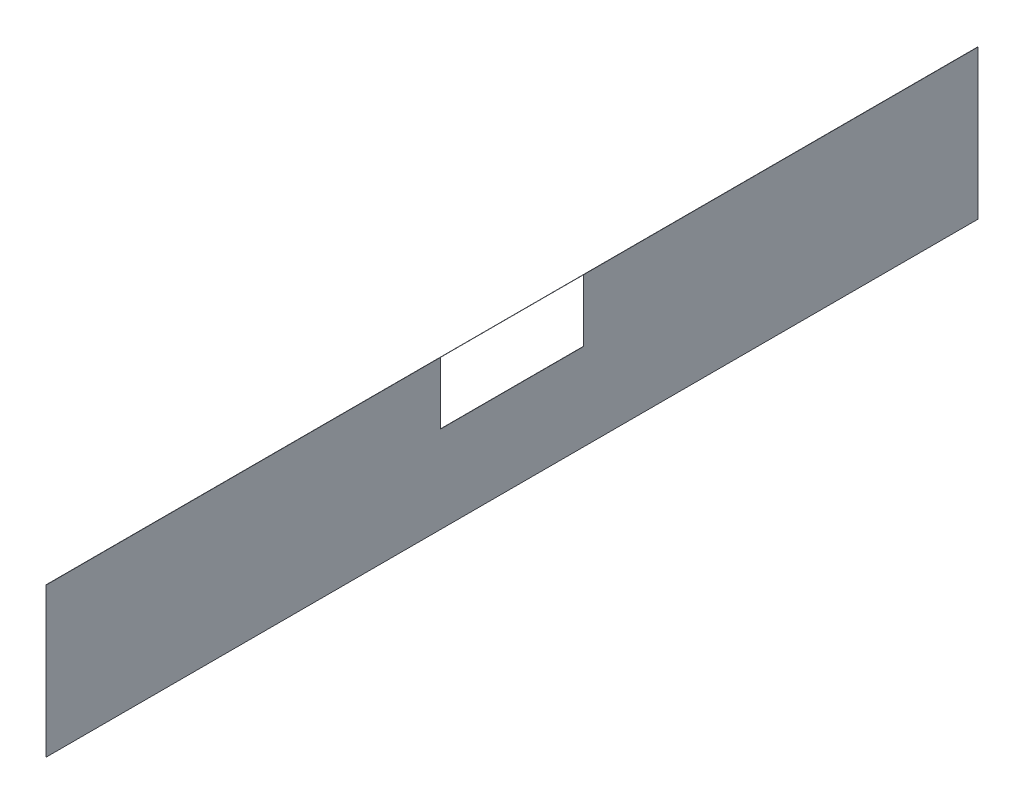
ISO-10303-21;
HEADER;
FILE_DESCRIPTION(('STEP AP214'),'2;1');
FILE_NAME('part.step','',(''),(''),'','','');
FILE_SCHEMA(('AUTOMOTIVE_DESIGN { 1 0 10303 214 1 1 1 1 }'));
ENDSEC;
DATA;
#1=APPLICATION_CONTEXT('core data for automotive mechanical design processes');
#2=APPLICATION_PROTOCOL_DEFINITION('international standard','automotive_design',2000,#1);
#3=PRODUCT_CONTEXT('',#1,'mechanical');
#4=PRODUCT('Part','Part','',(#3));
#5=PRODUCT_RELATED_PRODUCT_CATEGORY('part','',(#4));
#6=PRODUCT_DEFINITION_FORMATION('','',#4);
#7=PRODUCT_DEFINITION_CONTEXT('part definition',#1,'design');
#8=PRODUCT_DEFINITION('design','',#6,#7);
#9=PRODUCT_DEFINITION_SHAPE('','',#8);
#10=(LENGTH_UNIT() NAMED_UNIT(*) SI_UNIT(.MILLI.,.METRE.));
#11=(NAMED_UNIT(*) PLANE_ANGLE_UNIT() SI_UNIT($,.RADIAN.));
#12=(NAMED_UNIT(*) SI_UNIT($,.STERADIAN.) SOLID_ANGLE_UNIT());
#13=UNCERTAINTY_MEASURE_WITH_UNIT(LENGTH_MEASURE(1.E-05),#10,'distance_accuracy_value','');
#14=(GEOMETRIC_REPRESENTATION_CONTEXT(3) GLOBAL_UNCERTAINTY_ASSIGNED_CONTEXT((#13)) GLOBAL_UNIT_ASSIGNED_CONTEXT((#10,
#11,#12)) REPRESENTATION_CONTEXT('',''));
#15=CARTESIAN_POINT('',(0.,0.,0.));
#16=DIRECTION('',(0.,0.,1.));
#17=DIRECTION('',(1.,0.,0.));
#18=AXIS2_PLACEMENT_3D('',#15,#16,#17);
#19=CARTESIAN_POINT('',(-124.187199999927,60.0000000000481,-149.999999999981));
#20=DIRECTION('',(-2.36582975430166E-11,0.,1.));
#21=DIRECTION('',(1.,0.,2.36582975430166E-11));
#22=AXIS2_PLACEMENT_3D('',#19,#20,#21);
#23=PLANE('',#22);
#24=DIRECTION('',(5.91464377475148E-11,-1.,0.));
#25=VECTOR('',#24,1.);
#26=CARTESIAN_POINT('',(-124.110999999927,60.0000000000526,-149.999999999979));
#27=LINE('',#26,#25);
#28=CARTESIAN_POINT('',(-124.110999999928,60.0100000000526,-149.999999999979));
#29=VERTEX_POINT('',#28);
#30=CARTESIAN_POINT('',(-124.110999997088,12.0000000000526,-149.999999999979));
#31=VERTEX_POINT('',#30);
#32=EDGE_CURVE('E144',#29,#31,#27,.T.);
#33=ORIENTED_EDGE('',*,*,#32,.T.);
#34=DIRECTION('',(1.,5.82867087929999E-11,2.36582975432498E-11));
#35=VECTOR('',#34,1.);
#36=CARTESIAN_POINT('',(-134.110999997026,11.9999999994697,-150.000000000216));
#37=LINE('',#36,#35);
#38=CARTESIAN_POINT('',(-124.187199994928,12.0000000000482,-149.999999999981));
#39=VERTEX_POINT('',#38);
#40=EDGE_CURVE('E136',#39,#31,#37,.T.);
#41=ORIENTED_EDGE('',*,*,#40,.F.);
#42=DIRECTION('',(5.82867087928029E-11,-1.,5.55111512312408E-12));
#43=VECTOR('',#42,1.);
#44=CARTESIAN_POINT('',(-124.187199999928,60.0100000000481,-149.999999999981));
#45=LINE('',#44,#43);
#46=CARTESIAN_POINT('',(-124.187199999928,60.0100000000481,-149.999999999981));
#47=VERTEX_POINT('',#46);
#48=EDGE_CURVE('E145',#47,#39,#45,.T.);
#49=ORIENTED_EDGE('',*,*,#48,.F.);
#50=DIRECTION('',(1.,5.9146407457357E-11,2.36582975430166E-11));
#51=VECTOR('',#50,1.);
#52=CARTESIAN_POINT('',(-124.187199999928,60.0100000000481,-149.999999999981));
#53=LINE('',#52,#51);
#54=EDGE_CURVE('E153',#47,#29,#53,.T.);
#55=ORIENTED_EDGE('',*,*,#54,.T.);
#56=EDGE_LOOP('',(#33,#41,#49,#55));
#57=FACE_BOUND('',#56,.T.);
#58=ADVANCED_FACE('F43',(#57),#23,.F.);
#59=CARTESIAN_POINT('',(-124.187200007025,60.0000000000481,150.000000000019));
#60=DIRECTION('',(2.36582975431807E-11,-2.77555756018308E-12,-1.));
#61=DIRECTION('',(-1.,0.,-2.36582975431807E-11));
#62=AXIS2_PLACEMENT_3D('',#59,#60,#61);
#63=PLANE('',#62);
#64=DIRECTION('',(-5.91464377475148E-11,1.,0.));
#65=VECTOR('',#64,1.);
#66=CARTESIAN_POINT('',(-124.187200007025,60.0000000000481,150.000000000019));
#67=LINE('',#66,#65);
#68=CARTESIAN_POINT('',(-124.187200000575,12.0000000000481,150.000000000019));
#69=VERTEX_POINT('',#68);
#70=CARTESIAN_POINT('',(-124.187200007025,60.0100000000481,150.000000000019));
#71=VERTEX_POINT('',#70);
#72=EDGE_CURVE('E148',#69,#71,#67,.T.);
#73=ORIENTED_EDGE('',*,*,#72,.F.);
#74=DIRECTION('',(1.,5.82867087929999E-11,2.36582975432498E-11));
#75=VECTOR('',#74,1.);
#76=CARTESIAN_POINT('',(-134.111000004124,11.9999999994697,149.999999999785));
#77=LINE('',#76,#75);
#78=CARTESIAN_POINT('',(-124.111000004124,12.0000000000526,150.000000000021));
#79=VERTEX_POINT('',#78);
#80=EDGE_CURVE('E137',#69,#79,#77,.T.);
#81=ORIENTED_EDGE('',*,*,#80,.T.);
#82=DIRECTION('',(-5.82867087928029E-11,1.,-2.77555756156204E-12));
#83=VECTOR('',#82,1.);
#84=CARTESIAN_POINT('',(-124.111000007025,60.0000000000526,150.000000000021));
#85=LINE('',#84,#83);
#86=CARTESIAN_POINT('',(-124.111000007025,60.0100000000526,150.000000000021));
#87=VERTEX_POINT('',#86);
#88=EDGE_CURVE('E156',#79,#87,#85,.T.);
#89=ORIENTED_EDGE('',*,*,#88,.T.);
#90=DIRECTION('',(1.,5.9146407457357E-11,2.36582975430166E-11));
#91=VECTOR('',#90,1.);
#92=CARTESIAN_POINT('',(-124.187200007025,60.0100000000481,150.000000000019));
#93=LINE('',#92,#91);
#94=EDGE_CURVE('E162',#71,#87,#93,.T.);
#95=ORIENTED_EDGE('',*,*,#94,.F.);
#96=EDGE_LOOP('',(#73,#81,#89,#95));
#97=FACE_BOUND('',#96,.T.);
#98=ADVANCED_FACE('F189',(#97),#63,.F.);
#99=CARTESIAN_POINT('',(-124.187200007025,60.0100000000481,150.000000000019));
#100=DIRECTION('',(5.9146407457357E-11,-1.,0.));
#101=DIRECTION('',(1.,5.9146407457357E-11,0.));
#102=AXIS2_PLACEMENT_3D('',#99,#100,#101);
#103=PLANE('',#102);
#104=DIRECTION('',(2.36582975432498E-11,0.,-1.));
#105=VECTOR('',#104,1.);
#106=CARTESIAN_POINT('',(-124.111000007025,60.0100000000526,150.000000000021));
#107=LINE('',#106,#105);
#108=EDGE_CURVE('E149',#87,#29,#107,.T.);
#109=ORIENTED_EDGE('',*,*,#108,.T.);
#110=ORIENTED_EDGE('',*,*,#54,.F.);
#111=DIRECTION('',(2.36582975432498E-11,0.,-1.));
#112=VECTOR('',#111,1.);
#113=CARTESIAN_POINT('',(-124.187200007025,60.0100000000481,150.000000000019));
#114=LINE('',#113,#112);
#115=EDGE_CURVE('E151',#71,#47,#114,.T.);
#116=ORIENTED_EDGE('',*,*,#115,.F.);
#117=ORIENTED_EDGE('',*,*,#94,.T.);
#118=EDGE_LOOP('',(#109,#110,#116,#117));
#119=FACE_BOUND('',#118,.T.);
#120=ADVANCED_FACE('F195',(#119),#103,.F.);
#121=CARTESIAN_POINT('',(-124.187199999875,-7.23852867124085E-09,-2.9380577286601E-09));
#122=DIRECTION('',(1.,5.82867087929342E-11,2.36582975432498E-11));
#123=DIRECTION('',(-5.82867087929342E-11,1.,0.));
#124=AXIS2_PLACEMENT_3D('',#121,#122,#123);
#125=PLANE('',#124);
#126=DIRECTION('',(-5.82867087928208E-11,1.,0.));
#127=VECTOR('',#126,1.);
#128=CARTESIAN_POINT('',(-124.187200002751,40.0009999926549,22.9999999970619));
#129=LINE('',#128,#127);
#130=CARTESIAN_POINT('',(-124.187200002751,40.0009999926549,22.9999999970619));
#131=VERTEX_POINT('',#130);
#132=CARTESIAN_POINT('',(-124.187200003917,60.0009999926548,22.9999999970619));
#133=VERTEX_POINT('',#132);
#134=EDGE_CURVE('E118',#131,#133,#129,.T.);
#135=ORIENTED_EDGE('',*,*,#134,.F.);
#136=DIRECTION('',(-2.36583096108914E-11,0.,1.));
#137=VECTOR('',#136,1.);
#138=CARTESIAN_POINT('',(-124.187200001663,40.0009999926548,-23.000000002938));
#139=LINE('',#138,#137);
#140=CARTESIAN_POINT('',(-124.187200001663,40.0009999926548,-23.000000002938));
#141=VERTEX_POINT('',#140);
#142=EDGE_CURVE('E57',#141,#131,#139,.T.);
#143=ORIENTED_EDGE('',*,*,#142,.F.);
#144=DIRECTION('',(5.82867087928207E-11,-1.,0.));
#145=VECTOR('',#144,1.);
#146=CARTESIAN_POINT('',(-124.187200002829,60.0009999926548,-23.0000000029381));
#147=LINE('',#146,#145);
#148=CARTESIAN_POINT('',(-124.187200002829,60.0009999926548,-23.0000000029381));
#149=VERTEX_POINT('',#148);
#150=EDGE_CURVE('E125',#149,#141,#147,.T.);
#151=ORIENTED_EDGE('',*,*,#150,.F.);
#152=DIRECTION('',(2.36583096108914E-11,0.,-1.));
#153=VECTOR('',#152,1.);
#154=CARTESIAN_POINT('',(-124.187200002829,60.0009999926548,-23.0000000029381));
#155=LINE('',#154,#153);
#156=EDGE_CURVE('E109',#133,#149,#155,.T.);
#157=ORIENTED_EDGE('',*,*,#156,.F.);
#158=EDGE_LOOP('',(#135,#143,#151,#157));
#159=FACE_BOUND('',#158,.T.);
#160=ORIENTED_EDGE('',*,*,#48,.T.);
#161=DIRECTION('',(-2.36582975432498E-11,0.,1.));
#162=VECTOR('',#161,1.);
#163=CARTESIAN_POINT('',(-124.187200000575,12.0000000000482,-2.93805627150893E-09));
#164=LINE('',#163,#162);
#165=EDGE_CURVE('E140',#39,#69,#164,.T.);
#166=ORIENTED_EDGE('',*,*,#165,.T.);
#167=ORIENTED_EDGE('',*,*,#72,.T.);
#168=ORIENTED_EDGE('',*,*,#115,.T.);
#169=EDGE_LOOP('',(#160,#166,#167,#168));
#170=FACE_BOUND('',#169,.T.);
#171=ADVANCED_FACE('F122',(#159,#170),#125,.F.);
#172=CARTESIAN_POINT('',(-124.110999999875,-7.2340217149926E-09,-2.93625496638733E-09));
#173=DIRECTION('',(1.,5.82867087929342E-11,2.36582975432498E-11));
#174=DIRECTION('',(-5.82867087929342E-11,1.,0.));
#175=AXIS2_PLACEMENT_3D('',#172,#173,#174);
#176=PLANE('',#175);
#177=DIRECTION('',(2.36582975432498E-11,0.,-1.));
#178=VECTOR('',#177,1.);
#179=CARTESIAN_POINT('',(-124.111000002207,40.0009999926593,-2.93627306835738E-09));
#180=LINE('',#179,#178);
#181=CARTESIAN_POINT('',(-124.111000003334,40.0009999926593,22.9999999970637));
#182=VERTEX_POINT('',#181);
#183=CARTESIAN_POINT('',(-124.111000002246,40.0009999926593,-23.0000000029362));
#184=VERTEX_POINT('',#183);
#185=EDGE_CURVE('E11',#182,#184,#180,.T.);
#186=ORIENTED_EDGE('',*,*,#185,.F.);
#187=DIRECTION('',(5.82867087929342E-11,-1.,0.));
#188=VECTOR('',#187,1.);
#189=CARTESIAN_POINT('',(-124.11100000042,-7.23401772516032E-09,22.9999999970637));
#190=LINE('',#189,#188);
#191=CARTESIAN_POINT('',(-124.111000003917,60.0009999932377,22.9999999970637));
#192=VERTEX_POINT('',#191);
#193=EDGE_CURVE('E165',#192,#182,#190,.T.);
#194=ORIENTED_EDGE('',*,*,#193,.F.);
#195=DIRECTION('',(-2.36582975432498E-11,0.,1.));
#196=VECTOR('',#195,1.);
#197=CARTESIAN_POINT('',(-124.111000003373,60.0009999926593,-2.93625496647007E-09));
#198=LINE('',#197,#196);
#199=CARTESIAN_POINT('',(-124.111000003373,60.0009999926593,-23.0000000029363));
#200=VERTEX_POINT('',#199);
#201=EDGE_CURVE('E112',#200,#192,#198,.T.);
#202=ORIENTED_EDGE('',*,*,#201,.F.);
#203=DIRECTION('',(-5.82867087929342E-11,1.,0.));
#204=VECTOR('',#203,1.);
#205=CARTESIAN_POINT('',(-124.110999999331,-7.23402570482488E-09,-23.0000000029362));
#206=LINE('',#205,#204);
#207=EDGE_CURVE('E50',#184,#200,#206,.T.);
#208=ORIENTED_EDGE('',*,*,#207,.F.);
#209=EDGE_LOOP('',(#186,#194,#202,#208));
#210=FACE_BOUND('',#209,.T.);
#211=DIRECTION('',(-2.36582975432498E-11,0.,1.));
#212=VECTOR('',#211,1.);
#213=CARTESIAN_POINT('',(-124.111000004124,12.0000000000526,150.000000000021));
#214=LINE('',#213,#212);
#215=EDGE_CURVE('E132',#31,#79,#214,.T.);
#216=ORIENTED_EDGE('',*,*,#215,.F.);
#217=ORIENTED_EDGE('',*,*,#32,.F.);
#218=ORIENTED_EDGE('',*,*,#108,.F.);
#219=ORIENTED_EDGE('',*,*,#88,.F.);
#220=EDGE_LOOP('',(#216,#217,#218,#219));
#221=FACE_BOUND('',#220,.T.);
#222=ADVANCED_FACE('F173',(#210,#221),#176,.T.);
#223=CARTESIAN_POINT('',(-134.111000004124,11.9999999994697,149.999999999785));
#224=DIRECTION('',(-5.82867087929999E-11,1.,0.));
#225=DIRECTION('',(-1.,-5.82867087929999E-11,0.));
#226=AXIS2_PLACEMENT_3D('',#223,#224,#225);
#227=PLANE('',#226);
#228=ORIENTED_EDGE('',*,*,#40,.T.);
#229=ORIENTED_EDGE('',*,*,#215,.T.);
#230=ORIENTED_EDGE('',*,*,#80,.F.);
#231=ORIENTED_EDGE('',*,*,#165,.F.);
#232=EDGE_LOOP('',(#228,#229,#230,#231));
#233=FACE_BOUND('',#232,.T.);
#234=ADVANCED_FACE('F177',(#233),#227,.F.);
#235=CARTESIAN_POINT('',(-114.187200001663,40.0009999932377,-23.0000000027015));
#236=DIRECTION('',(5.82867087929999E-11,-1.,0.));
#237=DIRECTION('',(1.,5.82867087929999E-11,0.));
#238=AXIS2_PLACEMENT_3D('',#235,#236,#237);
#239=PLANE('',#238);
#240=ORIENTED_EDGE('',*,*,#185,.T.);
#241=DIRECTION('',(-1.,-5.82867087929999E-11,-2.36582975432498E-11));
#242=VECTOR('',#241,1.);
#243=CARTESIAN_POINT('',(-114.187200001663,40.0009999932377,-23.0000000027015));
#244=LINE('',#243,#242);
#245=EDGE_CURVE('E130',#184,#141,#244,.T.);
#246=ORIENTED_EDGE('',*,*,#245,.T.);
#247=ORIENTED_EDGE('',*,*,#142,.T.);
#248=DIRECTION('',(-1.,-5.82867087929999E-11,-2.36582975432498E-11));
#249=VECTOR('',#248,1.);
#250=CARTESIAN_POINT('',(-114.187200002751,40.0009999932377,22.9999999972985));
#251=LINE('',#250,#249);
#252=EDGE_CURVE('E115',#182,#131,#251,.T.);
#253=ORIENTED_EDGE('',*,*,#252,.F.);
#254=EDGE_LOOP('',(#240,#246,#247,#253));
#255=FACE_BOUND('',#254,.T.);
#256=ADVANCED_FACE('F175',(#255),#239,.F.);
#257=CARTESIAN_POINT('',(-114.187200002829,60.0009999932377,-23.0000000027015));
#258=DIRECTION('',(2.36582975432498E-11,0.,-1.));
#259=DIRECTION('',(-1.,0.,-2.36582975432498E-11));
#260=AXIS2_PLACEMENT_3D('',#257,#258,#259);
#261=PLANE('',#260);
#262=ORIENTED_EDGE('',*,*,#207,.T.);
#263=DIRECTION('',(-1.,-5.82867087929999E-11,-2.36582975432498E-11));
#264=VECTOR('',#263,1.);
#265=CARTESIAN_POINT('',(-114.187200002829,60.0009999932377,-23.0000000027015));
#266=LINE('',#265,#264);
#267=EDGE_CURVE('E114',#200,#149,#266,.T.);
#268=ORIENTED_EDGE('',*,*,#267,.T.);
#269=ORIENTED_EDGE('',*,*,#150,.T.);
#270=ORIENTED_EDGE('',*,*,#245,.F.);
#271=EDGE_LOOP('',(#262,#268,#269,#270));
#272=FACE_BOUND('',#271,.T.);
#273=ADVANCED_FACE('F170',(#272),#261,.F.);
#274=CARTESIAN_POINT('',(-114.187200002829,60.0009999932377,-23.0000000027015));
#275=DIRECTION('',(-5.82867087929999E-11,1.,0.));
#276=DIRECTION('',(-1.,-5.82867087929999E-11,0.));
#277=AXIS2_PLACEMENT_3D('',#274,#275,#276);
#278=PLANE('',#277);
#279=ORIENTED_EDGE('',*,*,#201,.T.);
#280=DIRECTION('',(-1.,-5.82867087929999E-11,-2.36582975432498E-11));
#281=VECTOR('',#280,1.);
#282=CARTESIAN_POINT('',(-114.187200003917,60.0009999932377,22.9999999972985));
#283=LINE('',#282,#281);
#284=EDGE_CURVE('E65',#192,#133,#283,.T.);
#285=ORIENTED_EDGE('',*,*,#284,.T.);
#286=ORIENTED_EDGE('',*,*,#156,.T.);
#287=ORIENTED_EDGE('',*,*,#267,.F.);
#288=EDGE_LOOP('',(#279,#285,#286,#287));
#289=FACE_BOUND('',#288,.T.);
#290=ADVANCED_FACE('F106',(#289),#278,.F.);
#291=CARTESIAN_POINT('',(-114.187200002751,40.0009999932377,22.9999999972985));
#292=DIRECTION('',(-2.36582975432498E-11,0.,1.));
#293=DIRECTION('',(1.,0.,2.36582975432498E-11));
#294=AXIS2_PLACEMENT_3D('',#291,#292,#293);
#295=PLANE('',#294);
#296=ORIENTED_EDGE('',*,*,#193,.T.);
#297=ORIENTED_EDGE('',*,*,#252,.T.);
#298=ORIENTED_EDGE('',*,*,#134,.T.);
#299=ORIENTED_EDGE('',*,*,#284,.F.);
#300=EDGE_LOOP('',(#296,#297,#298,#299));
#301=FACE_BOUND('',#300,.T.);
#302=ADVANCED_FACE('F119',(#301),#295,.F.);
#303=CLOSED_SHELL('',(#58,#98,#120,#171,#222,#234,#256,#273,#290,#302));
#304=MANIFOLD_SOLID_BREP('B2',#303);
#305=ADVANCED_BREP_SHAPE_REPRESENTATION('',(#18,#304),#14);
#306=SHAPE_DEFINITION_REPRESENTATION(#9,#305);
ENDSEC;
END-ISO-10303-21;
